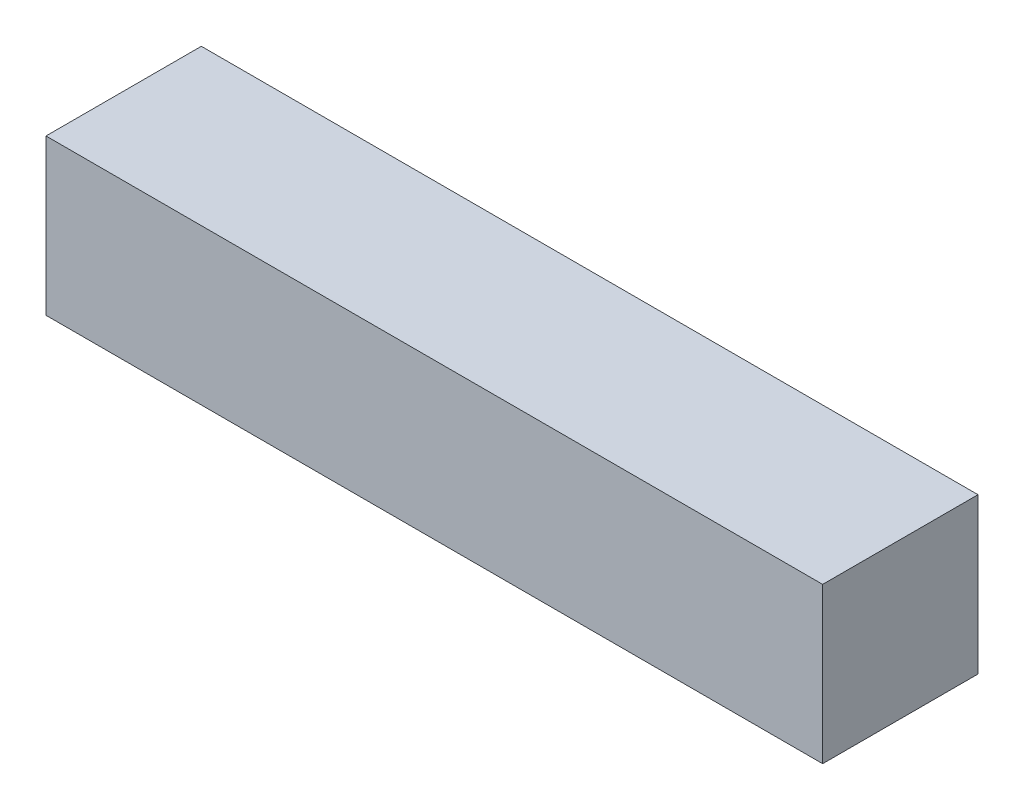
ISO-10303-21;
HEADER;
FILE_DESCRIPTION(('STEP AP214'),'2;1');
FILE_NAME('part.step','',(''),(''),'','','');
FILE_SCHEMA(('AUTOMOTIVE_DESIGN { 1 0 10303 214 1 1 1 1 }'));
ENDSEC;
DATA;
#1=APPLICATION_CONTEXT('core data for automotive mechanical design processes');
#2=APPLICATION_PROTOCOL_DEFINITION('international standard','automotive_design',2000,#1);
#3=PRODUCT_CONTEXT('',#1,'mechanical');
#4=PRODUCT('Part','Part','',(#3));
#5=PRODUCT_RELATED_PRODUCT_CATEGORY('part','',(#4));
#6=PRODUCT_DEFINITION_FORMATION('','',#4);
#7=PRODUCT_DEFINITION_CONTEXT('part definition',#1,'design');
#8=PRODUCT_DEFINITION('design','',#6,#7);
#9=PRODUCT_DEFINITION_SHAPE('','',#8);
#10=(LENGTH_UNIT() NAMED_UNIT(*) SI_UNIT(.MILLI.,.METRE.));
#11=(NAMED_UNIT(*) PLANE_ANGLE_UNIT() SI_UNIT($,.RADIAN.));
#12=(NAMED_UNIT(*) SI_UNIT($,.STERADIAN.) SOLID_ANGLE_UNIT());
#13=UNCERTAINTY_MEASURE_WITH_UNIT(LENGTH_MEASURE(1.E-05),#10,'distance_accuracy_value','');
#14=(GEOMETRIC_REPRESENTATION_CONTEXT(3) GLOBAL_UNCERTAINTY_ASSIGNED_CONTEXT((#13)) GLOBAL_UNIT_ASSIGNED_CONTEXT((#10,
#11,#12)) REPRESENTATION_CONTEXT('',''));
#15=CARTESIAN_POINT('',(0.,0.,0.));
#16=DIRECTION('',(0.,0.,1.));
#17=DIRECTION('',(1.,0.,0.));
#18=AXIS2_PLACEMENT_3D('',#15,#16,#17);
#19=CARTESIAN_POINT('',(0.,0.,22.));
#20=DIRECTION('',(1.,0.,0.));
#21=DIRECTION('',(0.,0.,-1.));
#22=AXIS2_PLACEMENT_3D('',#19,#20,#21);
#23=PLANE('',#22);
#24=DIRECTION('',(0.,-1.,0.));
#25=VECTOR('',#24,1.);
#26=CARTESIAN_POINT('',(0.,0.,0.));
#27=LINE('',#26,#25);
#28=CARTESIAN_POINT('',(0.,22.,0.));
#29=VERTEX_POINT('',#28);
#30=CARTESIAN_POINT('',(0.,0.,0.));
#31=VERTEX_POINT('',#30);
#32=EDGE_CURVE('E100',#29,#31,#27,.T.);
#33=ORIENTED_EDGE('',*,*,#32,.T.);
#34=DIRECTION('',(0.,0.,-1.));
#35=VECTOR('',#34,1.);
#36=CARTESIAN_POINT('',(0.,0.,22.));
#37=LINE('',#36,#35);
#38=CARTESIAN_POINT('',(0.,0.,22.));
#39=VERTEX_POINT('',#38);
#40=EDGE_CURVE('E11',#39,#31,#37,.T.);
#41=ORIENTED_EDGE('',*,*,#40,.F.);
#42=DIRECTION('',(0.,-1.,0.));
#43=VECTOR('',#42,1.);
#44=CARTESIAN_POINT('',(0.,0.,22.));
#45=LINE('',#44,#43);
#46=CARTESIAN_POINT('',(0.,22.,22.));
#47=VERTEX_POINT('',#46);
#48=EDGE_CURVE('E88',#47,#39,#45,.T.);
#49=ORIENTED_EDGE('',*,*,#48,.F.);
#50=DIRECTION('',(0.,0.,-1.));
#51=VECTOR('',#50,1.);
#52=CARTESIAN_POINT('',(0.,22.,22.));
#53=LINE('',#52,#51);
#54=EDGE_CURVE('E96',#47,#29,#53,.T.);
#55=ORIENTED_EDGE('',*,*,#54,.T.);
#56=EDGE_LOOP('',(#33,#41,#49,#55));
#57=FACE_BOUND('',#56,.T.);
#58=ADVANCED_FACE('F37',(#57),#23,.F.);
#59=CARTESIAN_POINT('',(0.,0.,22.));
#60=DIRECTION('',(0.,1.,0.));
#61=DIRECTION('',(0.,0.,1.));
#62=AXIS2_PLACEMENT_3D('',#59,#60,#61);
#63=PLANE('',#62);
#64=DIRECTION('',(1.,0.,0.));
#65=VECTOR('',#64,1.);
#66=CARTESIAN_POINT('',(0.,0.,0.));
#67=LINE('',#66,#65);
#68=CARTESIAN_POINT('',(110.,0.,0.));
#69=VERTEX_POINT('',#68);
#70=EDGE_CURVE('E92',#31,#69,#67,.T.);
#71=ORIENTED_EDGE('',*,*,#70,.T.);
#72=DIRECTION('',(0.,0.,-1.));
#73=VECTOR('',#72,1.);
#74=CARTESIAN_POINT('',(110.,0.,22.));
#75=LINE('',#74,#73);
#76=CARTESIAN_POINT('',(110.,0.,22.));
#77=VERTEX_POINT('',#76);
#78=EDGE_CURVE('E45',#77,#69,#75,.T.);
#79=ORIENTED_EDGE('',*,*,#78,.F.);
#80=DIRECTION('',(1.,0.,0.));
#81=VECTOR('',#80,1.);
#82=CARTESIAN_POINT('',(0.,0.,22.));
#83=LINE('',#82,#81);
#84=EDGE_CURVE('E83',#39,#77,#83,.T.);
#85=ORIENTED_EDGE('',*,*,#84,.F.);
#86=ORIENTED_EDGE('',*,*,#40,.T.);
#87=EDGE_LOOP('',(#71,#79,#85,#86));
#88=FACE_BOUND('',#87,.T.);
#89=ADVANCED_FACE('F91',(#88),#63,.F.);
#90=CARTESIAN_POINT('',(110.,0.,22.));
#91=DIRECTION('',(-1.,0.,0.));
#92=DIRECTION('',(0.,0.,1.));
#93=AXIS2_PLACEMENT_3D('',#90,#91,#92);
#94=PLANE('',#93);
#95=DIRECTION('',(0.,1.,0.));
#96=VECTOR('',#95,1.);
#97=CARTESIAN_POINT('',(110.,0.,0.));
#98=LINE('',#97,#96);
#99=CARTESIAN_POINT('',(110.,22.,0.));
#100=VERTEX_POINT('',#99);
#101=EDGE_CURVE('E70',#69,#100,#98,.T.);
#102=ORIENTED_EDGE('',*,*,#101,.T.);
#103=DIRECTION('',(0.,0.,-1.));
#104=VECTOR('',#103,1.);
#105=CARTESIAN_POINT('',(110.,22.,22.));
#106=LINE('',#105,#104);
#107=CARTESIAN_POINT('',(110.,22.,22.));
#108=VERTEX_POINT('',#107);
#109=EDGE_CURVE('E93',#108,#100,#106,.T.);
#110=ORIENTED_EDGE('',*,*,#109,.F.);
#111=DIRECTION('',(0.,1.,0.));
#112=VECTOR('',#111,1.);
#113=CARTESIAN_POINT('',(110.,0.,22.));
#114=LINE('',#113,#112);
#115=EDGE_CURVE('E86',#77,#108,#114,.T.);
#116=ORIENTED_EDGE('',*,*,#115,.F.);
#117=ORIENTED_EDGE('',*,*,#78,.T.);
#118=EDGE_LOOP('',(#102,#110,#116,#117));
#119=FACE_BOUND('',#118,.T.);
#120=ADVANCED_FACE('F94',(#119),#94,.F.);
#121=CARTESIAN_POINT('',(0.,22.,22.));
#122=DIRECTION('',(0.,-1.,0.));
#123=DIRECTION('',(0.,0.,-1.));
#124=AXIS2_PLACEMENT_3D('',#121,#122,#123);
#125=PLANE('',#124);
#126=DIRECTION('',(-1.,0.,0.));
#127=VECTOR('',#126,1.);
#128=CARTESIAN_POINT('',(0.,22.,0.));
#129=LINE('',#128,#127);
#130=EDGE_CURVE('E76',#100,#29,#129,.T.);
#131=ORIENTED_EDGE('',*,*,#130,.T.);
#132=ORIENTED_EDGE('',*,*,#54,.F.);
#133=DIRECTION('',(-1.,0.,0.));
#134=VECTOR('',#133,1.);
#135=CARTESIAN_POINT('',(0.,22.,22.));
#136=LINE('',#135,#134);
#137=EDGE_CURVE('E53',#108,#47,#136,.T.);
#138=ORIENTED_EDGE('',*,*,#137,.F.);
#139=ORIENTED_EDGE('',*,*,#109,.T.);
#140=EDGE_LOOP('',(#131,#132,#138,#139));
#141=FACE_BOUND('',#140,.T.);
#142=ADVANCED_FACE('F107',(#141),#125,.F.);
#143=CARTESIAN_POINT('',(0.,0.,22.));
#144=DIRECTION('',(0.,0.,-1.));
#145=DIRECTION('',(-1.,0.,0.));
#146=AXIS2_PLACEMENT_3D('',#143,#144,#145);
#147=PLANE('',#146);
#148=ORIENTED_EDGE('',*,*,#48,.T.);
#149=ORIENTED_EDGE('',*,*,#84,.T.);
#150=ORIENTED_EDGE('',*,*,#115,.T.);
#151=ORIENTED_EDGE('',*,*,#137,.T.);
#152=EDGE_LOOP('',(#148,#149,#150,#151));
#153=FACE_BOUND('',#152,.T.);
#154=ADVANCED_FACE('F84',(#153),#147,.F.);
#155=CARTESIAN_POINT('',(0.,0.,0.));
#156=DIRECTION('',(0.,0.,-1.));
#157=DIRECTION('',(-1.,0.,0.));
#158=AXIS2_PLACEMENT_3D('',#155,#156,#157);
#159=PLANE('',#158);
#160=ORIENTED_EDGE('',*,*,#32,.F.);
#161=ORIENTED_EDGE('',*,*,#130,.F.);
#162=ORIENTED_EDGE('',*,*,#101,.F.);
#163=ORIENTED_EDGE('',*,*,#70,.F.);
#164=EDGE_LOOP('',(#160,#161,#162,#163));
#165=FACE_BOUND('',#164,.T.);
#166=ADVANCED_FACE('F110',(#165),#159,.T.);
#167=CLOSED_SHELL('',(#58,#89,#120,#142,#154,#166));
#168=MANIFOLD_SOLID_BREP('B2',#167);
#169=ADVANCED_BREP_SHAPE_REPRESENTATION('',(#18,#168),#14);
#170=SHAPE_DEFINITION_REPRESENTATION(#9,#169);
ENDSEC;
END-ISO-10303-21;
